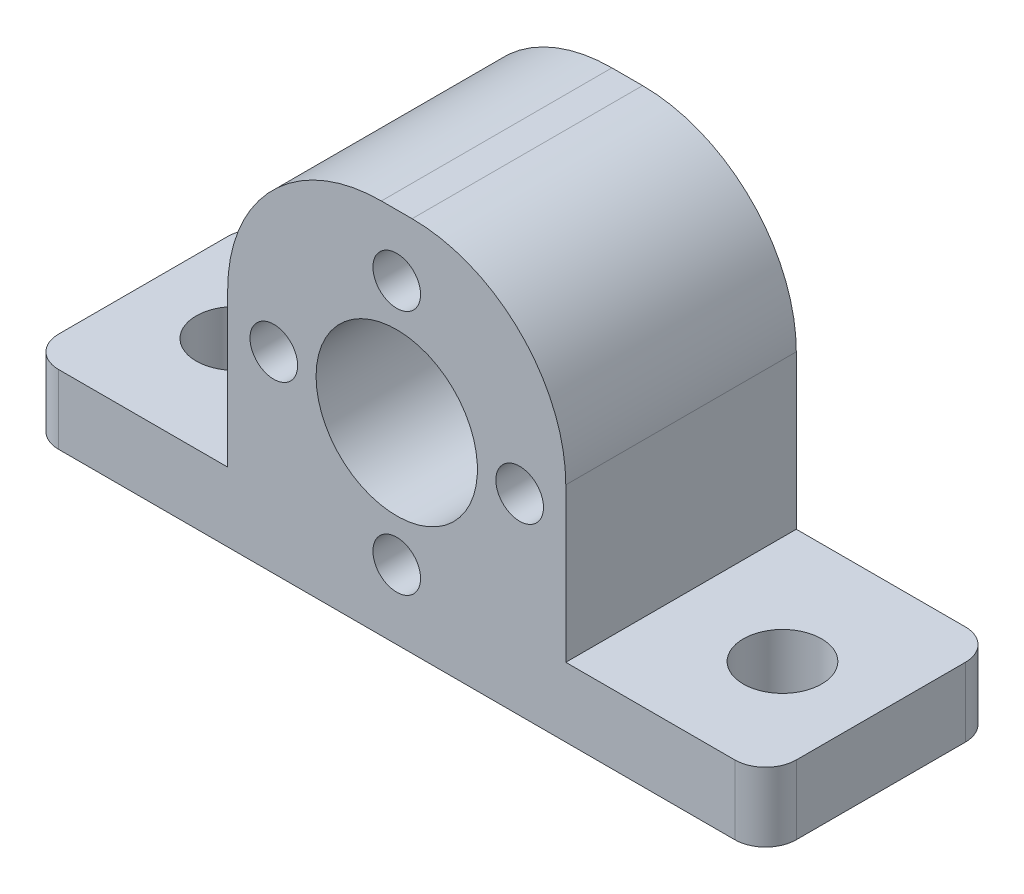
ISO-10303-21;
HEADER;
FILE_DESCRIPTION(('STEP AP214'),'2;1');
FILE_NAME('part.step','',(''),(''),'','','');
FILE_SCHEMA(('AUTOMOTIVE_DESIGN { 1 0 10303 214 1 1 1 1 }'));
ENDSEC;
DATA;
#1=APPLICATION_CONTEXT('core data for automotive mechanical design processes');
#2=APPLICATION_PROTOCOL_DEFINITION('international standard','automotive_design',2000,#1);
#3=PRODUCT_CONTEXT('',#1,'mechanical');
#4=PRODUCT('Part','Part','',(#3));
#5=PRODUCT_RELATED_PRODUCT_CATEGORY('part','',(#4));
#6=PRODUCT_DEFINITION_FORMATION('','',#4);
#7=PRODUCT_DEFINITION_CONTEXT('part definition',#1,'design');
#8=PRODUCT_DEFINITION('design','',#6,#7);
#9=PRODUCT_DEFINITION_SHAPE('','',#8);
#10=(LENGTH_UNIT() NAMED_UNIT(*) SI_UNIT(.MILLI.,.METRE.));
#11=(NAMED_UNIT(*) PLANE_ANGLE_UNIT() SI_UNIT($,.RADIAN.));
#12=(NAMED_UNIT(*) SI_UNIT($,.STERADIAN.) SOLID_ANGLE_UNIT());
#13=UNCERTAINTY_MEASURE_WITH_UNIT(LENGTH_MEASURE(1.E-05),#10,'distance_accuracy_value','');
#14=(GEOMETRIC_REPRESENTATION_CONTEXT(3) GLOBAL_UNCERTAINTY_ASSIGNED_CONTEXT((#13)) GLOBAL_UNIT_ASSIGNED_CONTEXT((#10,
#11,#12)) REPRESENTATION_CONTEXT('',''));
#15=CARTESIAN_POINT('',(0.,0.,0.));
#16=DIRECTION('',(0.,0.,1.));
#17=DIRECTION('',(1.,0.,0.));
#18=AXIS2_PLACEMENT_3D('',#15,#16,#17);
#19=CARTESIAN_POINT('',(0.,4.5,0.));
#20=DIRECTION('',(0.,1.,0.));
#21=DIRECTION('',(0.,0.,1.));
#22=AXIS2_PLACEMENT_3D('',#19,#20,#21);
#23=PLANE('',#22);
#24=CARTESIAN_POINT('',(-19.9485049833887,4.5,-0.398671096345487));
#25=DIRECTION('',(0.,1.,0.));
#26=DIRECTION('',(0.,0.,1.));
#27=AXIS2_PLACEMENT_3D('',#24,#25,#26);
#28=CIRCLE('',#27,2.55);
#29=CARTESIAN_POINT('',(-19.9485049833887,4.5,2.15132890365451));
#30=VERTEX_POINT('',#29);
#31=EDGE_CURVE('E293',#30,#30,#28,.T.);
#32=ORIENTED_EDGE('',*,*,#31,.F.);
#33=EDGE_LOOP('',(#32));
#34=FACE_BOUND('',#33,.T.);
#35=DIRECTION('',(-1.,0.,0.));
#36=VECTOR('',#35,1.);
#37=CARTESIAN_POINT('',(-25.9485049833887,4.5,-7.89867109634549));
#38=LINE('',#37,#36);
#39=CARTESIAN_POINT('',(-12.9485049833887,4.5,-7.89867109634549));
#40=VERTEX_POINT('',#39);
#41=CARTESIAN_POINT('',(-23.9485049833887,4.5,-7.89867109634549));
#42=VERTEX_POINT('',#41);
#43=EDGE_CURVE('E151',#40,#42,#38,.T.);
#44=ORIENTED_EDGE('',*,*,#43,.T.);
#45=CARTESIAN_POINT('',(-23.9485049833887,4.5,-5.89867109634549));
#46=DIRECTION('',(0.,1.,0.));
#47=DIRECTION('',(0.,0.,1.));
#48=AXIS2_PLACEMENT_3D('',#45,#46,#47);
#49=CIRCLE('',#48,2.);
#50=CARTESIAN_POINT('',(-25.9485049833887,4.5,-5.89867109634549));
#51=VERTEX_POINT('',#50);
#52=EDGE_CURVE('E11',#42,#51,#49,.T.);
#53=ORIENTED_EDGE('',*,*,#52,.T.);
#54=DIRECTION('',(0.,0.,1.));
#55=VECTOR('',#54,1.);
#56=CARTESIAN_POINT('',(-25.9485049833887,4.5,-7.89867109634549));
#57=LINE('',#56,#55);
#58=CARTESIAN_POINT('',(-25.9485049833887,4.5,5.10132890365451));
#59=VERTEX_POINT('',#58);
#60=EDGE_CURVE('E182',#51,#59,#57,.T.);
#61=ORIENTED_EDGE('',*,*,#60,.T.);
#62=CARTESIAN_POINT('',(-23.9485049833887,4.5,5.10132890365451));
#63=DIRECTION('',(0.,1.,0.));
#64=DIRECTION('',(0.,0.,1.));
#65=AXIS2_PLACEMENT_3D('',#62,#63,#64);
#66=CIRCLE('',#65,2.);
#67=CARTESIAN_POINT('',(-23.9485049833887,4.5,7.10132890365451));
#68=VERTEX_POINT('',#67);
#69=EDGE_CURVE('E44',#59,#68,#66,.T.);
#70=ORIENTED_EDGE('',*,*,#69,.T.);
#71=DIRECTION('',(1.,0.,0.));
#72=VECTOR('',#71,1.);
#73=CARTESIAN_POINT('',(-25.9485049833887,4.5,7.10132890365451));
#74=LINE('',#73,#72);
#75=CARTESIAN_POINT('',(-12.9485049833887,4.5,7.10132890365451));
#76=VERTEX_POINT('',#75);
#77=EDGE_CURVE('E186',#68,#76,#74,.T.);
#78=ORIENTED_EDGE('',*,*,#77,.T.);
#79=DIRECTION('',(0.,0.,1.));
#80=VECTOR('',#79,1.);
#81=CARTESIAN_POINT('',(-12.9485049833887,4.5,-7.89867109634549));
#82=LINE('',#81,#80);
#83=EDGE_CURVE('E166',#40,#76,#82,.T.);
#84=ORIENTED_EDGE('',*,*,#83,.F.);
#85=EDGE_LOOP('',(#44,#53,#61,#70,#78,#84));
#86=FACE_BOUND('',#85,.T.);
#87=ADVANCED_FACE('F36',(#34,#86),#23,.T.);
#88=CARTESIAN_POINT('',(-25.9485049833887,4.5,-7.89867109634549));
#89=DIRECTION('',(1.,0.,0.));
#90=DIRECTION('',(0.,0.,-1.));
#91=AXIS2_PLACEMENT_3D('',#88,#89,#90);
#92=PLANE('',#91);
#93=ORIENTED_EDGE('',*,*,#60,.F.);
#94=DIRECTION('',(0.,-1.,0.));
#95=VECTOR('',#94,1.);
#96=CARTESIAN_POINT('',(-25.9485049833887,4.5,-5.89867109634549));
#97=LINE('',#96,#95);
#98=CARTESIAN_POINT('',(-25.9485049833887,0.,-5.89867109634549));
#99=VERTEX_POINT('',#98);
#100=EDGE_CURVE('E241',#51,#99,#97,.T.);
#101=ORIENTED_EDGE('',*,*,#100,.T.);
#102=DIRECTION('',(0.,0.,1.));
#103=VECTOR('',#102,1.);
#104=CARTESIAN_POINT('',(-25.9485049833887,0.,-7.89867109634549));
#105=LINE('',#104,#103);
#106=CARTESIAN_POINT('',(-25.9485049833887,0.,5.10132890365451));
#107=VERTEX_POINT('',#106);
#108=EDGE_CURVE('E181',#99,#107,#105,.T.);
#109=ORIENTED_EDGE('',*,*,#108,.T.);
#110=DIRECTION('',(0.,-1.,0.));
#111=VECTOR('',#110,1.);
#112=CARTESIAN_POINT('',(-25.9485049833887,4.5,5.10132890365451));
#113=LINE('',#112,#111);
#114=EDGE_CURVE('E51',#107,#59,#113,.F.);
#115=ORIENTED_EDGE('',*,*,#114,.T.);
#116=EDGE_LOOP('',(#93,#101,#109,#115));
#117=FACE_BOUND('',#116,.T.);
#118=ADVANCED_FACE('F256',(#117),#92,.F.);
#119=CARTESIAN_POINT('',(-25.9485049833887,4.5,7.10132890365451));
#120=DIRECTION('',(0.,0.,-1.));
#121=DIRECTION('',(-1.,0.,0.));
#122=AXIS2_PLACEMENT_3D('',#119,#120,#121);
#123=PLANE('',#122);
#124=CARTESIAN_POINT('',(-1.94850498338871,20.5,7.10132890365451));
#125=DIRECTION('',(0.,0.,-1.));
#126=DIRECTION('',(-1.,0.,0.));
#127=AXIS2_PLACEMENT_3D('',#124,#125,#126);
#128=CIRCLE('',#127,1.55);
#129=CARTESIAN_POINT('',(-3.49850498338871,20.5,7.10132890365451));
#130=VERTEX_POINT('',#129);
#131=EDGE_CURVE('E290',#130,#130,#128,.T.);
#132=ORIENTED_EDGE('',*,*,#131,.T.);
#133=EDGE_LOOP('',(#132));
#134=FACE_BOUND('',#133,.T.);
#135=CARTESIAN_POINT('',(-9.94850498338871,12.5,7.10132890365451));
#136=DIRECTION('',(0.,0.,-1.));
#137=DIRECTION('',(-1.,0.,0.));
#138=AXIS2_PLACEMENT_3D('',#135,#136,#137);
#139=CIRCLE('',#138,1.55);
#140=CARTESIAN_POINT('',(-11.4985049833887,12.5,7.10132890365451));
#141=VERTEX_POINT('',#140);
#142=EDGE_CURVE('E300',#141,#141,#139,.T.);
#143=ORIENTED_EDGE('',*,*,#142,.T.);
#144=EDGE_LOOP('',(#143));
#145=FACE_BOUND('',#144,.T.);
#146=CARTESIAN_POINT('',(-1.94850498338871,4.5,7.10132890365451));
#147=DIRECTION('',(0.,0.,-1.));
#148=DIRECTION('',(-1.,0.,0.));
#149=AXIS2_PLACEMENT_3D('',#146,#147,#148);
#150=CIRCLE('',#149,1.55);
#151=CARTESIAN_POINT('',(-3.49850498338871,4.5,7.10132890365451));
#152=VERTEX_POINT('',#151);
#153=EDGE_CURVE('E303',#152,#152,#150,.T.);
#154=ORIENTED_EDGE('',*,*,#153,.T.);
#155=EDGE_LOOP('',(#154));
#156=FACE_BOUND('',#155,.T.);
#157=CARTESIAN_POINT('',(6.05149501661129,12.5,7.10132890365451));
#158=DIRECTION('',(0.,0.,-1.));
#159=DIRECTION('',(-1.,0.,0.));
#160=AXIS2_PLACEMENT_3D('',#157,#158,#159);
#161=CIRCLE('',#160,1.55);
#162=CARTESIAN_POINT('',(4.50149501661129,12.5,7.10132890365451));
#163=VERTEX_POINT('',#162);
#164=EDGE_CURVE('E306',#163,#163,#161,.T.);
#165=ORIENTED_EDGE('',*,*,#164,.T.);
#166=EDGE_LOOP('',(#165));
#167=FACE_BOUND('',#166,.T.);
#168=CARTESIAN_POINT('',(-1.94850498338871,12.5,7.10132890365451));
#169=DIRECTION('',(0.,0.,-1.));
#170=DIRECTION('',(-1.,0.,0.));
#171=AXIS2_PLACEMENT_3D('',#168,#169,#170);
#172=CIRCLE('',#171,5.25);
#173=CARTESIAN_POINT('',(-7.19850498338871,12.5,7.10132890365451));
#174=VERTEX_POINT('',#173);
#175=EDGE_CURVE('E309',#174,#174,#172,.T.);
#176=ORIENTED_EDGE('',*,*,#175,.T.);
#177=EDGE_LOOP('',(#176));
#178=FACE_BOUND('',#177,.T.);
#179=DIRECTION('',(1.,0.,0.));
#180=VECTOR('',#179,1.);
#181=CARTESIAN_POINT('',(-25.9485049833887,0.,7.10132890365451));
#182=LINE('',#181,#180);
#183=CARTESIAN_POINT('',(-23.9485049833887,0.,7.10132890365451));
#184=VERTEX_POINT('',#183);
#185=CARTESIAN_POINT('',(20.0514950166113,0.,7.10132890365451));
#186=VERTEX_POINT('',#185);
#187=EDGE_CURVE('E191',#184,#186,#182,.T.);
#188=ORIENTED_EDGE('',*,*,#187,.T.);
#189=DIRECTION('',(0.,-1.,0.));
#190=VECTOR('',#189,1.);
#191=CARTESIAN_POINT('',(20.0514950166113,4.5,7.10132890365451));
#192=LINE('',#191,#190);
#193=CARTESIAN_POINT('',(20.0514950166113,4.5,7.10132890365451));
#194=VERTEX_POINT('',#193);
#195=EDGE_CURVE('E238',#186,#194,#192,.F.);
#196=ORIENTED_EDGE('',*,*,#195,.T.);
#197=CARTESIAN_POINT('',(9.05149501661129,4.5,7.10132890365451));
#198=VERTEX_POINT('',#197);
#199=EDGE_CURVE('E184',#198,#194,#74,.T.);
#200=ORIENTED_EDGE('',*,*,#199,.F.);
#201=DIRECTION('',(0.,-1.,0.));
#202=VECTOR('',#201,1.);
#203=CARTESIAN_POINT('',(9.05149501661129,24.5,7.10132890365451));
#204=LINE('',#203,#202);
#205=CARTESIAN_POINT('',(9.05149501661129,14.5,7.10132890365451));
#206=VERTEX_POINT('',#205);
#207=EDGE_CURVE('E160',#206,#198,#204,.T.);
#208=ORIENTED_EDGE('',*,*,#207,.F.);
#209=CARTESIAN_POINT('',(-0.948504983388705,14.5,7.10132890365451));
#210=DIRECTION('',(0.,0.,-1.));
#211=DIRECTION('',(-1.,0.,0.));
#212=AXIS2_PLACEMENT_3D('',#209,#210,#211);
#213=CIRCLE('',#212,10.);
#214=CARTESIAN_POINT('',(-0.948504983388705,24.5,7.10132890365451));
#215=VERTEX_POINT('',#214);
#216=EDGE_CURVE('E211',#206,#215,#213,.F.);
#217=ORIENTED_EDGE('',*,*,#216,.T.);
#218=DIRECTION('',(1.,0.,0.));
#219=VECTOR('',#218,1.);
#220=CARTESIAN_POINT('',(-12.9485049833887,24.5,7.10132890365451));
#221=LINE('',#220,#219);
#222=CARTESIAN_POINT('',(-2.9485049833887,24.5,7.10132890365451));
#223=VERTEX_POINT('',#222);
#224=EDGE_CURVE('E165',#223,#215,#221,.T.);
#225=ORIENTED_EDGE('',*,*,#224,.F.);
#226=CARTESIAN_POINT('',(-2.9485049833887,14.5,7.10132890365451));
#227=DIRECTION('',(0.,0.,-1.));
#228=DIRECTION('',(-1.,0.,0.));
#229=AXIS2_PLACEMENT_3D('',#226,#227,#228);
#230=CIRCLE('',#229,10.);
#231=CARTESIAN_POINT('',(-12.9485049833887,14.5,7.10132890365451));
#232=VERTEX_POINT('',#231);
#233=EDGE_CURVE('E209',#223,#232,#230,.F.);
#234=ORIENTED_EDGE('',*,*,#233,.T.);
#235=DIRECTION('',(0.,-1.,0.));
#236=VECTOR('',#235,1.);
#237=CARTESIAN_POINT('',(-12.9485049833887,24.5,7.10132890365451));
#238=LINE('',#237,#236);
#239=EDGE_CURVE('E178',#232,#76,#238,.T.);
#240=ORIENTED_EDGE('',*,*,#239,.T.);
#241=ORIENTED_EDGE('',*,*,#77,.F.);
#242=DIRECTION('',(0.,-1.,0.));
#243=VECTOR('',#242,1.);
#244=CARTESIAN_POINT('',(-23.9485049833887,4.5,7.10132890365451));
#245=LINE('',#244,#243);
#246=EDGE_CURVE('E235',#68,#184,#245,.T.);
#247=ORIENTED_EDGE('',*,*,#246,.T.);
#248=EDGE_LOOP('',(#188,#196,#200,#208,#217,#225,#234,#240,#241,#247));
#249=FACE_BOUND('',#248,.T.);
#250=ADVANCED_FACE('F249',(#134,#145,#156,#167,#178,#249),#123,.F.);
#251=CARTESIAN_POINT('',(22.0514950166113,4.5,-7.89867109634549));
#252=DIRECTION('',(-1.,0.,0.));
#253=DIRECTION('',(0.,0.,1.));
#254=AXIS2_PLACEMENT_3D('',#251,#252,#253);
#255=PLANE('',#254);
#256=DIRECTION('',(0.,0.,-1.));
#257=VECTOR('',#256,1.);
#258=CARTESIAN_POINT('',(22.0514950166113,0.,-7.89867109634549));
#259=LINE('',#258,#257);
#260=CARTESIAN_POINT('',(22.0514950166113,0.,5.10132890365451));
#261=VERTEX_POINT('',#260);
#262=CARTESIAN_POINT('',(22.0514950166113,0.,-5.89867109634549));
#263=VERTEX_POINT('',#262);
#264=EDGE_CURVE('E194',#261,#263,#259,.T.);
#265=ORIENTED_EDGE('',*,*,#264,.T.);
#266=DIRECTION('',(0.,-1.,0.));
#267=VECTOR('',#266,1.);
#268=CARTESIAN_POINT('',(22.0514950166113,4.5,-5.89867109634549));
#269=LINE('',#268,#267);
#270=CARTESIAN_POINT('',(22.0514950166113,4.5,-5.89867109634549));
#271=VERTEX_POINT('',#270);
#272=EDGE_CURVE('E230',#263,#271,#269,.F.);
#273=ORIENTED_EDGE('',*,*,#272,.T.);
#274=DIRECTION('',(0.,0.,-1.));
#275=VECTOR('',#274,1.);
#276=CARTESIAN_POINT('',(22.0514950166113,4.5,-7.89867109634549));
#277=LINE('',#276,#275);
#278=CARTESIAN_POINT('',(22.0514950166113,4.5,5.10132890365451));
#279=VERTEX_POINT('',#278);
#280=EDGE_CURVE('E188',#279,#271,#277,.T.);
#281=ORIENTED_EDGE('',*,*,#280,.F.);
#282=DIRECTION('',(0.,-1.,0.));
#283=VECTOR('',#282,1.);
#284=CARTESIAN_POINT('',(22.0514950166113,4.5,5.10132890365451));
#285=LINE('',#284,#283);
#286=EDGE_CURVE('E227',#279,#261,#285,.T.);
#287=ORIENTED_EDGE('',*,*,#286,.T.);
#288=EDGE_LOOP('',(#265,#273,#281,#287));
#289=FACE_BOUND('',#288,.T.);
#290=ADVANCED_FACE('F267',(#289),#255,.F.);
#291=CARTESIAN_POINT('',(-25.9485049833887,4.5,-7.89867109634549));
#292=DIRECTION('',(0.,0.,1.));
#293=DIRECTION('',(1.,0.,0.));
#294=AXIS2_PLACEMENT_3D('',#291,#292,#293);
#295=PLANE('',#294);
#296=CARTESIAN_POINT('',(-1.94850498338871,20.5,-7.89867109634549));
#297=DIRECTION('',(0.,0.,-1.));
#298=DIRECTION('',(-1.,0.,0.));
#299=AXIS2_PLACEMENT_3D('',#296,#297,#298);
#300=CIRCLE('',#299,1.55);
#301=CARTESIAN_POINT('',(-3.49850498338871,20.5,-7.89867109634549));
#302=VERTEX_POINT('',#301);
#303=EDGE_CURVE('E315',#302,#302,#300,.T.);
#304=ORIENTED_EDGE('',*,*,#303,.F.);
#305=EDGE_LOOP('',(#304));
#306=FACE_BOUND('',#305,.T.);
#307=CARTESIAN_POINT('',(-9.94850498338871,12.5,-7.89867109634549));
#308=DIRECTION('',(0.,0.,-1.));
#309=DIRECTION('',(-1.,0.,0.));
#310=AXIS2_PLACEMENT_3D('',#307,#308,#309);
#311=CIRCLE('',#310,1.55);
#312=CARTESIAN_POINT('',(-11.4985049833887,12.5,-7.89867109634549));
#313=VERTEX_POINT('',#312);
#314=EDGE_CURVE('E316',#313,#313,#311,.T.);
#315=ORIENTED_EDGE('',*,*,#314,.F.);
#316=EDGE_LOOP('',(#315));
#317=FACE_BOUND('',#316,.T.);
#318=CARTESIAN_POINT('',(-1.94850498338871,4.5,-7.89867109634549));
#319=DIRECTION('',(0.,0.,-1.));
#320=DIRECTION('',(-1.,0.,0.));
#321=AXIS2_PLACEMENT_3D('',#318,#319,#320);
#322=CIRCLE('',#321,1.55);
#323=CARTESIAN_POINT('',(-3.49850498338871,4.5,-7.89867109634549));
#324=VERTEX_POINT('',#323);
#325=EDGE_CURVE('E319',#324,#324,#322,.T.);
#326=ORIENTED_EDGE('',*,*,#325,.F.);
#327=EDGE_LOOP('',(#326));
#328=FACE_BOUND('',#327,.T.);
#329=CARTESIAN_POINT('',(6.05149501661129,12.5,-7.89867109634549));
#330=DIRECTION('',(0.,0.,-1.));
#331=DIRECTION('',(-1.,0.,0.));
#332=AXIS2_PLACEMENT_3D('',#329,#330,#331);
#333=CIRCLE('',#332,1.55);
#334=CARTESIAN_POINT('',(4.50149501661129,12.5,-7.89867109634549));
#335=VERTEX_POINT('',#334);
#336=EDGE_CURVE('E322',#335,#335,#333,.T.);
#337=ORIENTED_EDGE('',*,*,#336,.F.);
#338=EDGE_LOOP('',(#337));
#339=FACE_BOUND('',#338,.T.);
#340=CARTESIAN_POINT('',(-1.94850498338871,12.5,-7.89867109634549));
#341=DIRECTION('',(0.,0.,-1.));
#342=DIRECTION('',(-1.,0.,0.));
#343=AXIS2_PLACEMENT_3D('',#340,#341,#342);
#344=CIRCLE('',#343,5.25);
#345=CARTESIAN_POINT('',(-7.19850498338871,12.5,-7.89867109634549));
#346=VERTEX_POINT('',#345);
#347=EDGE_CURVE('E312',#346,#346,#344,.T.);
#348=ORIENTED_EDGE('',*,*,#347,.F.);
#349=EDGE_LOOP('',(#348));
#350=FACE_BOUND('',#349,.T.);
#351=CARTESIAN_POINT('',(20.0514950166113,4.5,-7.89867109634549));
#352=VERTEX_POINT('',#351);
#353=CARTESIAN_POINT('',(9.05149501661129,4.5,-7.89867109634549));
#354=VERTEX_POINT('',#353);
#355=EDGE_CURVE('E137',#352,#354,#38,.T.);
#356=ORIENTED_EDGE('',*,*,#355,.F.);
#357=DIRECTION('',(0.,-1.,0.));
#358=VECTOR('',#357,1.);
#359=CARTESIAN_POINT('',(20.0514950166113,4.5,-7.89867109634549));
#360=LINE('',#359,#358);
#361=CARTESIAN_POINT('',(20.0514950166113,0.,-7.89867109634549));
#362=VERTEX_POINT('',#361);
#363=EDGE_CURVE('E217',#352,#362,#360,.T.);
#364=ORIENTED_EDGE('',*,*,#363,.T.);
#365=DIRECTION('',(-1.,0.,0.));
#366=VECTOR('',#365,1.);
#367=CARTESIAN_POINT('',(-25.9485049833887,0.,-7.89867109634549));
#368=LINE('',#367,#366);
#369=CARTESIAN_POINT('',(-23.9485049833887,0.,-7.89867109634549));
#370=VERTEX_POINT('',#369);
#371=EDGE_CURVE('E185',#362,#370,#368,.T.);
#372=ORIENTED_EDGE('',*,*,#371,.T.);
#373=DIRECTION('',(0.,-1.,0.));
#374=VECTOR('',#373,1.);
#375=CARTESIAN_POINT('',(-23.9485049833887,4.5,-7.89867109634549));
#376=LINE('',#375,#374);
#377=EDGE_CURVE('E215',#370,#42,#376,.F.);
#378=ORIENTED_EDGE('',*,*,#377,.T.);
#379=ORIENTED_EDGE('',*,*,#43,.F.);
#380=DIRECTION('',(0.,-1.,0.));
#381=VECTOR('',#380,1.);
#382=CARTESIAN_POINT('',(-12.9485049833887,24.5,-7.89867109634549));
#383=LINE('',#382,#381);
#384=CARTESIAN_POINT('',(-12.9485049833887,14.5,-7.89867109634549));
#385=VERTEX_POINT('',#384);
#386=EDGE_CURVE('E161',#385,#40,#383,.T.);
#387=ORIENTED_EDGE('',*,*,#386,.F.);
#388=CARTESIAN_POINT('',(-2.94850498338871,14.5,-7.89867109634549));
#389=DIRECTION('',(0.,0.,1.));
#390=DIRECTION('',(1.,0.,0.));
#391=AXIS2_PLACEMENT_3D('',#388,#389,#390);
#392=CIRCLE('',#391,10.);
#393=CARTESIAN_POINT('',(-2.94850498338871,24.5,-7.89867109634549));
#394=VERTEX_POINT('',#393);
#395=EDGE_CURVE('E204',#385,#394,#392,.F.);
#396=ORIENTED_EDGE('',*,*,#395,.T.);
#397=DIRECTION('',(-1.,0.,0.));
#398=VECTOR('',#397,1.);
#399=CARTESIAN_POINT('',(-12.9485049833887,24.5,-7.89867109634549));
#400=LINE('',#399,#398);
#401=CARTESIAN_POINT('',(-0.948504983388705,24.5,-7.89867109634549));
#402=VERTEX_POINT('',#401);
#403=EDGE_CURVE('E169',#402,#394,#400,.T.);
#404=ORIENTED_EDGE('',*,*,#403,.F.);
#405=CARTESIAN_POINT('',(-0.948504983388705,14.5,-7.89867109634549));
#406=DIRECTION('',(0.,0.,1.));
#407=DIRECTION('',(1.,0.,0.));
#408=AXIS2_PLACEMENT_3D('',#405,#406,#407);
#409=CIRCLE('',#408,10.);
#410=CARTESIAN_POINT('',(9.05149501661129,14.5,-7.89867109634549));
#411=VERTEX_POINT('',#410);
#412=EDGE_CURVE('E157',#402,#411,#409,.F.);
#413=ORIENTED_EDGE('',*,*,#412,.T.);
#414=DIRECTION('',(0.,-1.,0.));
#415=VECTOR('',#414,1.);
#416=CARTESIAN_POINT('',(9.05149501661129,24.5,-7.89867109634549));
#417=LINE('',#416,#415);
#418=EDGE_CURVE('E154',#411,#354,#417,.T.);
#419=ORIENTED_EDGE('',*,*,#418,.T.);
#420=EDGE_LOOP('',(#356,#364,#372,#378,#379,#387,#396,#404,#413,#419));
#421=FACE_BOUND('',#420,.T.);
#422=ADVANCED_FACE('F155',(#306,#317,#328,#339,#350,#421),#295,.F.);
#423=CARTESIAN_POINT('',(16.0514950166113,4.5,0.));
#424=DIRECTION('',(0.,1.,0.));
#425=DIRECTION('',(0.,0.,1.));
#426=AXIS2_PLACEMENT_3D('',#423,#424,#425);
#427=CIRCLE('',#426,2.55);
#428=CARTESIAN_POINT('',(16.0514950166113,4.5,2.55));
#429=VERTEX_POINT('',#428);
#430=EDGE_CURVE('E286',#429,#429,#427,.T.);
#431=ORIENTED_EDGE('',*,*,#430,.F.);
#432=EDGE_LOOP('',(#431));
#433=FACE_BOUND('',#432,.T.);
#434=ORIENTED_EDGE('',*,*,#280,.T.);
#435=CARTESIAN_POINT('',(20.0514950166113,4.5,-5.89867109634549));
#436=DIRECTION('',(0.,1.,0.));
#437=DIRECTION('',(0.,0.,1.));
#438=AXIS2_PLACEMENT_3D('',#435,#436,#437);
#439=CIRCLE('',#438,2.);
#440=EDGE_CURVE('E146',#271,#352,#439,.T.);
#441=ORIENTED_EDGE('',*,*,#440,.T.);
#442=ORIENTED_EDGE('',*,*,#355,.T.);
#443=DIRECTION('',(0.,0.,-1.));
#444=VECTOR('',#443,1.);
#445=CARTESIAN_POINT('',(9.05149501661129,4.5,-7.89867109634549));
#446=LINE('',#445,#444);
#447=EDGE_CURVE('E143',#198,#354,#446,.T.);
#448=ORIENTED_EDGE('',*,*,#447,.F.);
#449=ORIENTED_EDGE('',*,*,#199,.T.);
#450=CARTESIAN_POINT('',(20.0514950166113,4.5,5.10132890365451));
#451=DIRECTION('',(0.,1.,0.));
#452=DIRECTION('',(0.,0.,1.));
#453=AXIS2_PLACEMENT_3D('',#450,#451,#452);
#454=CIRCLE('',#453,2.);
#455=EDGE_CURVE('E232',#194,#279,#454,.T.);
#456=ORIENTED_EDGE('',*,*,#455,.T.);
#457=EDGE_LOOP('',(#434,#441,#442,#448,#449,#456));
#458=FACE_BOUND('',#457,.T.);
#459=ADVANCED_FACE('F140',(#433,#458),#23,.T.);
#460=CARTESIAN_POINT('',(0.,0.,0.));
#461=DIRECTION('',(0.,1.,0.));
#462=DIRECTION('',(0.,0.,1.));
#463=AXIS2_PLACEMENT_3D('',#460,#461,#462);
#464=PLANE('',#463);
#465=CARTESIAN_POINT('',(-19.9485049833887,0.,-0.398671096345487));
#466=DIRECTION('',(0.,1.,0.));
#467=DIRECTION('',(0.,0.,1.));
#468=AXIS2_PLACEMENT_3D('',#465,#466,#467);
#469=CIRCLE('',#468,2.55);
#470=CARTESIAN_POINT('',(-19.9485049833887,0.,2.15132890365451));
#471=VERTEX_POINT('',#470);
#472=EDGE_CURVE('E172',#471,#471,#469,.T.);
#473=ORIENTED_EDGE('',*,*,#472,.T.);
#474=EDGE_LOOP('',(#473));
#475=FACE_BOUND('',#474,.T.);
#476=CARTESIAN_POINT('',(16.0514950166113,0.,0.));
#477=DIRECTION('',(0.,1.,0.));
#478=DIRECTION('',(0.,0.,1.));
#479=AXIS2_PLACEMENT_3D('',#476,#477,#478);
#480=CIRCLE('',#479,2.55);
#481=CARTESIAN_POINT('',(16.0514950166113,0.,2.55));
#482=VERTEX_POINT('',#481);
#483=EDGE_CURVE('E289',#482,#482,#480,.T.);
#484=ORIENTED_EDGE('',*,*,#483,.T.);
#485=EDGE_LOOP('',(#484));
#486=FACE_BOUND('',#485,.T.);
#487=ORIENTED_EDGE('',*,*,#371,.F.);
#488=CARTESIAN_POINT('',(20.0514950166113,0.,-5.89867109634549));
#489=DIRECTION('',(0.,1.,0.));
#490=DIRECTION('',(0.,0.,1.));
#491=AXIS2_PLACEMENT_3D('',#488,#489,#490);
#492=CIRCLE('',#491,2.);
#493=EDGE_CURVE('E225',#362,#263,#492,.F.);
#494=ORIENTED_EDGE('',*,*,#493,.T.);
#495=ORIENTED_EDGE('',*,*,#264,.F.);
#496=CARTESIAN_POINT('',(20.0514950166113,0.,5.10132890365451));
#497=DIRECTION('',(0.,1.,0.));
#498=DIRECTION('',(0.,0.,1.));
#499=AXIS2_PLACEMENT_3D('',#496,#497,#498);
#500=CIRCLE('',#499,2.);
#501=EDGE_CURVE('E223',#261,#186,#500,.F.);
#502=ORIENTED_EDGE('',*,*,#501,.T.);
#503=ORIENTED_EDGE('',*,*,#187,.F.);
#504=CARTESIAN_POINT('',(-23.9485049833887,0.,5.10132890365451));
#505=DIRECTION('',(0.,1.,0.));
#506=DIRECTION('',(0.,0.,1.));
#507=AXIS2_PLACEMENT_3D('',#504,#505,#506);
#508=CIRCLE('',#507,2.);
#509=EDGE_CURVE('E219',#184,#107,#508,.F.);
#510=ORIENTED_EDGE('',*,*,#509,.T.);
#511=ORIENTED_EDGE('',*,*,#108,.F.);
#512=CARTESIAN_POINT('',(-23.9485049833887,0.,-5.89867109634549));
#513=DIRECTION('',(0.,1.,0.));
#514=DIRECTION('',(0.,0.,1.));
#515=AXIS2_PLACEMENT_3D('',#512,#513,#514);
#516=CIRCLE('',#515,2.);
#517=EDGE_CURVE('E221',#99,#370,#516,.F.);
#518=ORIENTED_EDGE('',*,*,#517,.T.);
#519=EDGE_LOOP('',(#487,#494,#495,#502,#503,#510,#511,#518));
#520=FACE_BOUND('',#519,.T.);
#521=ADVANCED_FACE('F255',(#475,#486,#520),#464,.F.);
#522=CARTESIAN_POINT('',(-12.9485049833887,24.5,-7.89867109634549));
#523=DIRECTION('',(1.,0.,0.));
#524=DIRECTION('',(0.,0.,-1.));
#525=AXIS2_PLACEMENT_3D('',#522,#523,#524);
#526=PLANE('',#525);
#527=ORIENTED_EDGE('',*,*,#239,.F.);
#528=DIRECTION('',(0.,0.,1.));
#529=VECTOR('',#528,1.);
#530=CARTESIAN_POINT('',(-12.9485049833887,14.5,-7.89867109634549));
#531=LINE('',#530,#529);
#532=EDGE_CURVE('E213',#232,#385,#531,.F.);
#533=ORIENTED_EDGE('',*,*,#532,.T.);
#534=ORIENTED_EDGE('',*,*,#386,.T.);
#535=ORIENTED_EDGE('',*,*,#83,.T.);
#536=EDGE_LOOP('',(#527,#533,#534,#535));
#537=FACE_BOUND('',#536,.T.);
#538=ADVANCED_FACE('F370',(#537),#526,.F.);
#539=CARTESIAN_POINT('',(9.05149501661129,24.5,-7.89867109634549));
#540=DIRECTION('',(-1.,0.,0.));
#541=DIRECTION('',(0.,0.,1.));
#542=AXIS2_PLACEMENT_3D('',#539,#540,#541);
#543=PLANE('',#542);
#544=ORIENTED_EDGE('',*,*,#418,.F.);
#545=DIRECTION('',(0.,0.,-1.));
#546=VECTOR('',#545,1.);
#547=CARTESIAN_POINT('',(9.05149501661129,14.5,7.10132890365451));
#548=LINE('',#547,#546);
#549=EDGE_CURVE('E207',#411,#206,#548,.F.);
#550=ORIENTED_EDGE('',*,*,#549,.T.);
#551=ORIENTED_EDGE('',*,*,#207,.T.);
#552=ORIENTED_EDGE('',*,*,#447,.T.);
#553=EDGE_LOOP('',(#544,#550,#551,#552));
#554=FACE_BOUND('',#553,.T.);
#555=ADVANCED_FACE('F163',(#554),#543,.F.);
#556=CARTESIAN_POINT('',(0.,24.5,0.));
#557=DIRECTION('',(0.,1.,0.));
#558=DIRECTION('',(0.,0.,1.));
#559=AXIS2_PLACEMENT_3D('',#556,#557,#558);
#560=PLANE('',#559);
#561=ORIENTED_EDGE('',*,*,#224,.T.);
#562=DIRECTION('',(0.,0.,-1.));
#563=VECTOR('',#562,1.);
#564=CARTESIAN_POINT('',(-0.948504983388705,24.5,-7.89867109634549));
#565=LINE('',#564,#563);
#566=EDGE_CURVE('E201',#215,#402,#565,.T.);
#567=ORIENTED_EDGE('',*,*,#566,.T.);
#568=ORIENTED_EDGE('',*,*,#403,.T.);
#569=DIRECTION('',(0.,0.,1.));
#570=VECTOR('',#569,1.);
#571=CARTESIAN_POINT('',(-2.9485049833887,24.5,7.10132890365451));
#572=LINE('',#571,#570);
#573=EDGE_CURVE('E150',#394,#223,#572,.T.);
#574=ORIENTED_EDGE('',*,*,#573,.T.);
#575=EDGE_LOOP('',(#561,#567,#568,#574));
#576=FACE_BOUND('',#575,.T.);
#577=ADVANCED_FACE('F281',(#576),#560,.T.);
#578=CARTESIAN_POINT('',(-0.948504983388705,14.5,0.));
#579=DIRECTION('',(0.,0.,1.));
#580=DIRECTION('',(1.,0.,0.));
#581=AXIS2_PLACEMENT_3D('',#578,#579,#580);
#582=CYLINDRICAL_SURFACE('',#581,10.);
#583=ORIENTED_EDGE('',*,*,#216,.F.);
#584=ORIENTED_EDGE('',*,*,#549,.F.);
#585=ORIENTED_EDGE('',*,*,#412,.F.);
#586=ORIENTED_EDGE('',*,*,#566,.F.);
#587=EDGE_LOOP('',(#583,#584,#585,#586));
#588=FACE_BOUND('',#587,.T.);
#589=ADVANCED_FACE('F278',(#588),#582,.T.);
#590=CARTESIAN_POINT('',(-2.94850498338871,14.5,0.));
#591=DIRECTION('',(0.,0.,-1.));
#592=DIRECTION('',(-1.,0.,0.));
#593=AXIS2_PLACEMENT_3D('',#590,#591,#592);
#594=CYLINDRICAL_SURFACE('',#593,10.);
#595=ORIENTED_EDGE('',*,*,#395,.F.);
#596=ORIENTED_EDGE('',*,*,#532,.F.);
#597=ORIENTED_EDGE('',*,*,#233,.F.);
#598=ORIENTED_EDGE('',*,*,#573,.F.);
#599=EDGE_LOOP('',(#595,#596,#597,#598));
#600=FACE_BOUND('',#599,.T.);
#601=ADVANCED_FACE('F376',(#600),#594,.T.);
#602=CARTESIAN_POINT('',(16.0514950166113,0.,0.));
#603=DIRECTION('',(0.,1.,0.));
#604=DIRECTION('',(0.,0.,1.));
#605=AXIS2_PLACEMENT_3D('',#602,#603,#604);
#606=CYLINDRICAL_SURFACE('',#605,2.55);
#607=ORIENTED_EDGE('',*,*,#483,.F.);
#608=EDGE_LOOP('',(#607));
#609=FACE_BOUND('',#608,.T.);
#610=ORIENTED_EDGE('',*,*,#430,.T.);
#611=EDGE_LOOP('',(#610));
#612=FACE_BOUND('',#611,.T.);
#613=ADVANCED_FACE('F374',(#609,#612),#606,.F.);
#614=CARTESIAN_POINT('',(-19.9485049833887,0.,-0.398671096345487));
#615=DIRECTION('',(0.,1.,0.));
#616=DIRECTION('',(0.,0.,1.));
#617=AXIS2_PLACEMENT_3D('',#614,#615,#616);
#618=CYLINDRICAL_SURFACE('',#617,2.55);
#619=ORIENTED_EDGE('',*,*,#472,.F.);
#620=EDGE_LOOP('',(#619));
#621=FACE_BOUND('',#620,.T.);
#622=ORIENTED_EDGE('',*,*,#31,.T.);
#623=EDGE_LOOP('',(#622));
#624=FACE_BOUND('',#623,.T.);
#625=ADVANCED_FACE('F343',(#621,#624),#618,.F.);
#626=CARTESIAN_POINT('',(-1.94850498338871,12.5,12.1013289036545));
#627=DIRECTION('',(0.,0.,-1.));
#628=DIRECTION('',(-1.,0.,0.));
#629=AXIS2_PLACEMENT_3D('',#626,#627,#628);
#630=CYLINDRICAL_SURFACE('',#629,5.25);
#631=ORIENTED_EDGE('',*,*,#347,.T.);
#632=EDGE_LOOP('',(#631));
#633=FACE_BOUND('',#632,.T.);
#634=ORIENTED_EDGE('',*,*,#175,.F.);
#635=EDGE_LOOP('',(#634));
#636=FACE_BOUND('',#635,.T.);
#637=ADVANCED_FACE('F339',(#633,#636),#630,.F.);
#638=CARTESIAN_POINT('',(6.05149501661129,12.5,12.1013289036545));
#639=DIRECTION('',(0.,0.,-1.));
#640=DIRECTION('',(-1.,0.,0.));
#641=AXIS2_PLACEMENT_3D('',#638,#639,#640);
#642=CYLINDRICAL_SURFACE('',#641,1.55);
#643=ORIENTED_EDGE('',*,*,#336,.T.);
#644=EDGE_LOOP('',(#643));
#645=FACE_BOUND('',#644,.T.);
#646=ORIENTED_EDGE('',*,*,#164,.F.);
#647=EDGE_LOOP('',(#646));
#648=FACE_BOUND('',#647,.T.);
#649=ADVANCED_FACE('F342',(#645,#648),#642,.F.);
#650=CARTESIAN_POINT('',(-1.94850498338871,4.5,12.1013289036545));
#651=DIRECTION('',(0.,0.,-1.));
#652=DIRECTION('',(-1.,0.,0.));
#653=AXIS2_PLACEMENT_3D('',#650,#651,#652);
#654=CYLINDRICAL_SURFACE('',#653,1.55);
#655=ORIENTED_EDGE('',*,*,#325,.T.);
#656=EDGE_LOOP('',(#655));
#657=FACE_BOUND('',#656,.T.);
#658=ORIENTED_EDGE('',*,*,#153,.F.);
#659=EDGE_LOOP('',(#658));
#660=FACE_BOUND('',#659,.T.);
#661=ADVANCED_FACE('F328',(#657,#660),#654,.F.);
#662=CARTESIAN_POINT('',(-9.94850498338871,12.5,12.1013289036545));
#663=DIRECTION('',(0.,0.,-1.));
#664=DIRECTION('',(-1.,0.,0.));
#665=AXIS2_PLACEMENT_3D('',#662,#663,#664);
#666=CYLINDRICAL_SURFACE('',#665,1.55);
#667=ORIENTED_EDGE('',*,*,#314,.T.);
#668=EDGE_LOOP('',(#667));
#669=FACE_BOUND('',#668,.T.);
#670=ORIENTED_EDGE('',*,*,#142,.F.);
#671=EDGE_LOOP('',(#670));
#672=FACE_BOUND('',#671,.T.);
#673=ADVANCED_FACE('F451',(#669,#672),#666,.F.);
#674=CARTESIAN_POINT('',(-1.94850498338871,20.5,12.1013289036545));
#675=DIRECTION('',(0.,0.,-1.));
#676=DIRECTION('',(-1.,0.,0.));
#677=AXIS2_PLACEMENT_3D('',#674,#675,#676);
#678=CYLINDRICAL_SURFACE('',#677,1.55);
#679=ORIENTED_EDGE('',*,*,#303,.T.);
#680=EDGE_LOOP('',(#679));
#681=FACE_BOUND('',#680,.T.);
#682=ORIENTED_EDGE('',*,*,#131,.F.);
#683=EDGE_LOOP('',(#682));
#684=FACE_BOUND('',#683,.T.);
#685=ADVANCED_FACE('F460',(#681,#684),#678,.F.);
#686=CARTESIAN_POINT('',(20.0514950166113,4.5,-5.89867109634549));
#687=DIRECTION('',(0.,-1.,0.));
#688=DIRECTION('',(0.,0.,-1.));
#689=AXIS2_PLACEMENT_3D('',#686,#687,#688);
#690=CYLINDRICAL_SURFACE('',#689,2.);
#691=ORIENTED_EDGE('',*,*,#440,.F.);
#692=ORIENTED_EDGE('',*,*,#272,.F.);
#693=ORIENTED_EDGE('',*,*,#493,.F.);
#694=ORIENTED_EDGE('',*,*,#363,.F.);
#695=EDGE_LOOP('',(#691,#692,#693,#694));
#696=FACE_BOUND('',#695,.T.);
#697=ADVANCED_FACE('F263',(#696),#690,.T.);
#698=CARTESIAN_POINT('',(20.0514950166113,4.5,5.10132890365451));
#699=DIRECTION('',(0.,-1.,0.));
#700=DIRECTION('',(0.,0.,-1.));
#701=AXIS2_PLACEMENT_3D('',#698,#699,#700);
#702=CYLINDRICAL_SURFACE('',#701,2.);
#703=ORIENTED_EDGE('',*,*,#455,.F.);
#704=ORIENTED_EDGE('',*,*,#195,.F.);
#705=ORIENTED_EDGE('',*,*,#501,.F.);
#706=ORIENTED_EDGE('',*,*,#286,.F.);
#707=EDGE_LOOP('',(#703,#704,#705,#706));
#708=FACE_BOUND('',#707,.T.);
#709=ADVANCED_FACE('F272',(#708),#702,.T.);
#710=CARTESIAN_POINT('',(-23.9485049833887,4.5,-5.89867109634549));
#711=DIRECTION('',(0.,-1.,0.));
#712=DIRECTION('',(0.,0.,-1.));
#713=AXIS2_PLACEMENT_3D('',#710,#711,#712);
#714=CYLINDRICAL_SURFACE('',#713,2.);
#715=ORIENTED_EDGE('',*,*,#52,.F.);
#716=ORIENTED_EDGE('',*,*,#377,.F.);
#717=ORIENTED_EDGE('',*,*,#517,.F.);
#718=ORIENTED_EDGE('',*,*,#100,.F.);
#719=EDGE_LOOP('',(#715,#716,#717,#718));
#720=FACE_BOUND('',#719,.T.);
#721=ADVANCED_FACE('F259',(#720),#714,.T.);
#722=CARTESIAN_POINT('',(-23.9485049833887,4.5,5.10132890365451));
#723=DIRECTION('',(0.,-1.,0.));
#724=DIRECTION('',(0.,0.,-1.));
#725=AXIS2_PLACEMENT_3D('',#722,#723,#724);
#726=CYLINDRICAL_SURFACE('',#725,2.);
#727=ORIENTED_EDGE('',*,*,#69,.F.);
#728=ORIENTED_EDGE('',*,*,#114,.F.);
#729=ORIENTED_EDGE('',*,*,#509,.F.);
#730=ORIENTED_EDGE('',*,*,#246,.F.);
#731=EDGE_LOOP('',(#727,#728,#729,#730));
#732=FACE_BOUND('',#731,.T.);
#733=ADVANCED_FACE('F38',(#732),#726,.T.);
#734=CLOSED_SHELL('',(#87,#118,#250,#290,#422,#459,#521,#538,#555,#577,#589,#601,#613,#625,#637,
#649,#661,#673,#685,#697,#709,#721,#733));
#735=MANIFOLD_SOLID_BREP('B2',#734);
#736=ADVANCED_BREP_SHAPE_REPRESENTATION('',(#18,#735),#14);
#737=SHAPE_DEFINITION_REPRESENTATION(#9,#736);
ENDSEC;
END-ISO-10303-21;
